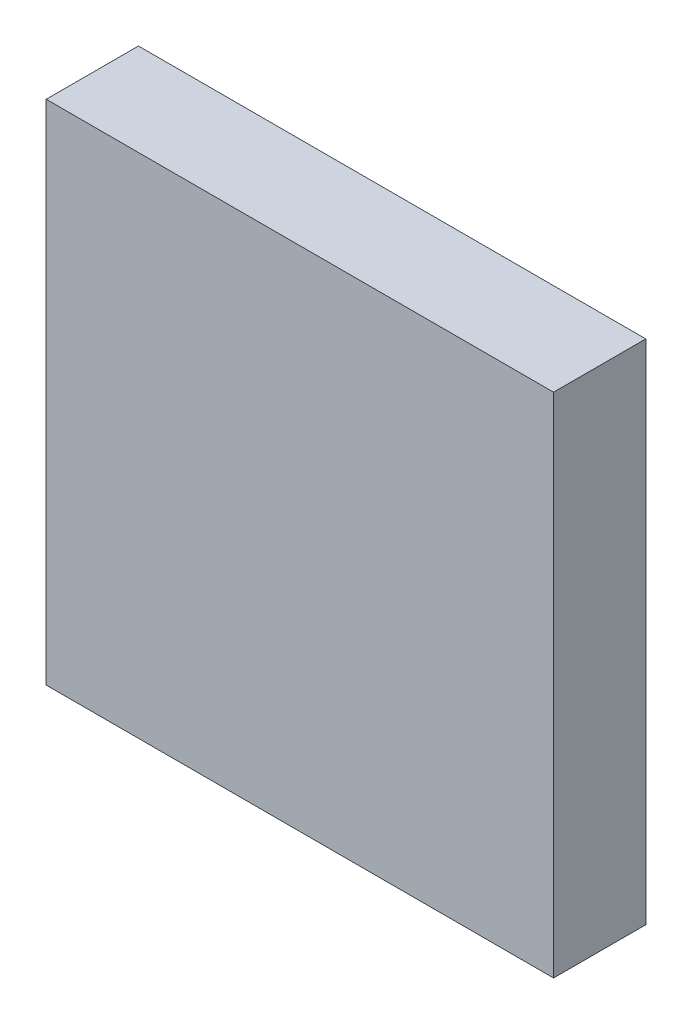
ISO-10303-21;
HEADER;
FILE_DESCRIPTION(('STEP AP214'),'2;1');
FILE_NAME('part.step','',(''),(''),'','','');
FILE_SCHEMA(('AUTOMOTIVE_DESIGN { 1 0 10303 214 1 1 1 1 }'));
ENDSEC;
DATA;
#1=APPLICATION_CONTEXT('core data for automotive mechanical design processes');
#2=APPLICATION_PROTOCOL_DEFINITION('international standard','automotive_design',2000,#1);
#3=PRODUCT_CONTEXT('',#1,'mechanical');
#4=PRODUCT('Part','Part','',(#3));
#5=PRODUCT_RELATED_PRODUCT_CATEGORY('part','',(#4));
#6=PRODUCT_DEFINITION_FORMATION('','',#4);
#7=PRODUCT_DEFINITION_CONTEXT('part definition',#1,'design');
#8=PRODUCT_DEFINITION('design','',#6,#7);
#9=PRODUCT_DEFINITION_SHAPE('','',#8);
#10=(LENGTH_UNIT() NAMED_UNIT(*) SI_UNIT(.MILLI.,.METRE.));
#11=(NAMED_UNIT(*) PLANE_ANGLE_UNIT() SI_UNIT($,.RADIAN.));
#12=(NAMED_UNIT(*) SI_UNIT($,.STERADIAN.) SOLID_ANGLE_UNIT());
#13=UNCERTAINTY_MEASURE_WITH_UNIT(LENGTH_MEASURE(1.E-05),#10,'distance_accuracy_value','');
#14=(GEOMETRIC_REPRESENTATION_CONTEXT(3) GLOBAL_UNCERTAINTY_ASSIGNED_CONTEXT((#13)) GLOBAL_UNIT_ASSIGNED_CONTEXT((#10,
#11,#12)) REPRESENTATION_CONTEXT('',''));
#15=CARTESIAN_POINT('',(0.,0.,0.));
#16=DIRECTION('',(0.,0.,1.));
#17=DIRECTION('',(1.,0.,0.));
#18=AXIS2_PLACEMENT_3D('',#15,#16,#17);
#19=CARTESIAN_POINT('',(-69.85,139.7,-12.7));
#20=DIRECTION('',(1.,0.,0.));
#21=DIRECTION('',(0.,0.,-1.));
#22=AXIS2_PLACEMENT_3D('',#19,#20,#21);
#23=PLANE('',#22);
#24=DIRECTION('',(0.,0.,1.));
#25=VECTOR('',#24,1.);
#26=CARTESIAN_POINT('',(-69.85,0.,-12.7));
#27=LINE('',#26,#25);
#28=CARTESIAN_POINT('',(-69.85,0.,-12.7));
#29=VERTEX_POINT('',#28);
#30=CARTESIAN_POINT('',(-69.85,0.,12.7));
#31=VERTEX_POINT('',#30);
#32=EDGE_CURVE('E96',#29,#31,#27,.T.);
#33=ORIENTED_EDGE('',*,*,#32,.T.);
#34=DIRECTION('',(0.,-1.,0.));
#35=VECTOR('',#34,1.);
#36=CARTESIAN_POINT('',(-69.85,139.7,12.7));
#37=LINE('',#36,#35);
#38=CARTESIAN_POINT('',(-69.85,139.7,12.7));
#39=VERTEX_POINT('',#38);
#40=EDGE_CURVE('E11',#39,#31,#37,.T.);
#41=ORIENTED_EDGE('',*,*,#40,.F.);
#42=DIRECTION('',(0.,0.,1.));
#43=VECTOR('',#42,1.);
#44=CARTESIAN_POINT('',(-69.85,139.7,-12.7));
#45=LINE('',#44,#43);
#46=CARTESIAN_POINT('',(-69.85,139.7,-12.7));
#47=VERTEX_POINT('',#46);
#48=EDGE_CURVE('E84',#47,#39,#45,.T.);
#49=ORIENTED_EDGE('',*,*,#48,.F.);
#50=DIRECTION('',(0.,-1.,0.));
#51=VECTOR('',#50,1.);
#52=CARTESIAN_POINT('',(-69.85,139.7,-12.7));
#53=LINE('',#52,#51);
#54=EDGE_CURVE('E92',#47,#29,#53,.T.);
#55=ORIENTED_EDGE('',*,*,#54,.T.);
#56=EDGE_LOOP('',(#33,#41,#49,#55));
#57=FACE_BOUND('',#56,.T.);
#58=ADVANCED_FACE('F33',(#57),#23,.F.);
#59=CARTESIAN_POINT('',(-69.85,139.7,12.7));
#60=DIRECTION('',(0.,0.,-1.));
#61=DIRECTION('',(-1.,0.,0.));
#62=AXIS2_PLACEMENT_3D('',#59,#60,#61);
#63=PLANE('',#62);
#64=DIRECTION('',(1.,0.,0.));
#65=VECTOR('',#64,1.);
#66=CARTESIAN_POINT('',(-69.85,0.,12.7));
#67=LINE('',#66,#65);
#68=CARTESIAN_POINT('',(69.85,0.,12.7));
#69=VERTEX_POINT('',#68);
#70=EDGE_CURVE('E88',#31,#69,#67,.T.);
#71=ORIENTED_EDGE('',*,*,#70,.T.);
#72=DIRECTION('',(0.,-1.,0.));
#73=VECTOR('',#72,1.);
#74=CARTESIAN_POINT('',(69.85,139.7,12.7));
#75=LINE('',#74,#73);
#76=CARTESIAN_POINT('',(69.85,139.7,12.7));
#77=VERTEX_POINT('',#76);
#78=EDGE_CURVE('E41',#77,#69,#75,.T.);
#79=ORIENTED_EDGE('',*,*,#78,.F.);
#80=DIRECTION('',(1.,0.,0.));
#81=VECTOR('',#80,1.);
#82=CARTESIAN_POINT('',(-69.85,139.7,12.7));
#83=LINE('',#82,#81);
#84=EDGE_CURVE('E79',#39,#77,#83,.T.);
#85=ORIENTED_EDGE('',*,*,#84,.F.);
#86=ORIENTED_EDGE('',*,*,#40,.T.);
#87=EDGE_LOOP('',(#71,#79,#85,#86));
#88=FACE_BOUND('',#87,.T.);
#89=ADVANCED_FACE('F87',(#88),#63,.F.);
#90=CARTESIAN_POINT('',(69.85,139.7,-12.7));
#91=DIRECTION('',(-1.,0.,0.));
#92=DIRECTION('',(0.,0.,1.));
#93=AXIS2_PLACEMENT_3D('',#90,#91,#92);
#94=PLANE('',#93);
#95=DIRECTION('',(0.,0.,-1.));
#96=VECTOR('',#95,1.);
#97=CARTESIAN_POINT('',(69.85,0.,-12.7));
#98=LINE('',#97,#96);
#99=CARTESIAN_POINT('',(69.85,0.,-12.7));
#100=VERTEX_POINT('',#99);
#101=EDGE_CURVE('E66',#69,#100,#98,.T.);
#102=ORIENTED_EDGE('',*,*,#101,.T.);
#103=DIRECTION('',(0.,-1.,0.));
#104=VECTOR('',#103,1.);
#105=CARTESIAN_POINT('',(69.85,139.7,-12.7));
#106=LINE('',#105,#104);
#107=CARTESIAN_POINT('',(69.85,139.7,-12.7));
#108=VERTEX_POINT('',#107);
#109=EDGE_CURVE('E89',#108,#100,#106,.T.);
#110=ORIENTED_EDGE('',*,*,#109,.F.);
#111=DIRECTION('',(0.,0.,-1.));
#112=VECTOR('',#111,1.);
#113=CARTESIAN_POINT('',(69.85,139.7,-12.7));
#114=LINE('',#113,#112);
#115=EDGE_CURVE('E82',#77,#108,#114,.T.);
#116=ORIENTED_EDGE('',*,*,#115,.F.);
#117=ORIENTED_EDGE('',*,*,#78,.T.);
#118=EDGE_LOOP('',(#102,#110,#116,#117));
#119=FACE_BOUND('',#118,.T.);
#120=ADVANCED_FACE('F90',(#119),#94,.F.);
#121=CARTESIAN_POINT('',(-69.85,139.7,-12.7));
#122=DIRECTION('',(0.,0.,1.));
#123=DIRECTION('',(1.,0.,0.));
#124=AXIS2_PLACEMENT_3D('',#121,#122,#123);
#125=PLANE('',#124);
#126=DIRECTION('',(-1.,0.,0.));
#127=VECTOR('',#126,1.);
#128=CARTESIAN_POINT('',(-69.85,0.,-12.7));
#129=LINE('',#128,#127);
#130=EDGE_CURVE('E72',#100,#29,#129,.T.);
#131=ORIENTED_EDGE('',*,*,#130,.T.);
#132=ORIENTED_EDGE('',*,*,#54,.F.);
#133=DIRECTION('',(-1.,0.,0.));
#134=VECTOR('',#133,1.);
#135=CARTESIAN_POINT('',(-69.85,139.7,-12.7));
#136=LINE('',#135,#134);
#137=EDGE_CURVE('E49',#108,#47,#136,.T.);
#138=ORIENTED_EDGE('',*,*,#137,.F.);
#139=ORIENTED_EDGE('',*,*,#109,.T.);
#140=EDGE_LOOP('',(#131,#132,#138,#139));
#141=FACE_BOUND('',#140,.T.);
#142=ADVANCED_FACE('F103',(#141),#125,.F.);
#143=CARTESIAN_POINT('',(0.,139.7,0.));
#144=DIRECTION('',(0.,1.,0.));
#145=DIRECTION('',(0.,0.,1.));
#146=AXIS2_PLACEMENT_3D('',#143,#144,#145);
#147=PLANE('',#146);
#148=ORIENTED_EDGE('',*,*,#48,.T.);
#149=ORIENTED_EDGE('',*,*,#84,.T.);
#150=ORIENTED_EDGE('',*,*,#115,.T.);
#151=ORIENTED_EDGE('',*,*,#137,.T.);
#152=EDGE_LOOP('',(#148,#149,#150,#151));
#153=FACE_BOUND('',#152,.T.);
#154=ADVANCED_FACE('F80',(#153),#147,.T.);
#155=CARTESIAN_POINT('',(0.,0.,0.));
#156=DIRECTION('',(0.,1.,0.));
#157=DIRECTION('',(0.,0.,1.));
#158=AXIS2_PLACEMENT_3D('',#155,#156,#157);
#159=PLANE('',#158);
#160=ORIENTED_EDGE('',*,*,#32,.F.);
#161=ORIENTED_EDGE('',*,*,#130,.F.);
#162=ORIENTED_EDGE('',*,*,#101,.F.);
#163=ORIENTED_EDGE('',*,*,#70,.F.);
#164=EDGE_LOOP('',(#160,#161,#162,#163));
#165=FACE_BOUND('',#164,.T.);
#166=ADVANCED_FACE('F106',(#165),#159,.F.);
#167=CLOSED_SHELL('',(#58,#89,#120,#142,#154,#166));
#168=MANIFOLD_SOLID_BREP('B2',#167);
#169=ADVANCED_BREP_SHAPE_REPRESENTATION('',(#18,#168),#14);
#170=SHAPE_DEFINITION_REPRESENTATION(#9,#169);
ENDSEC;
END-ISO-10303-21;
